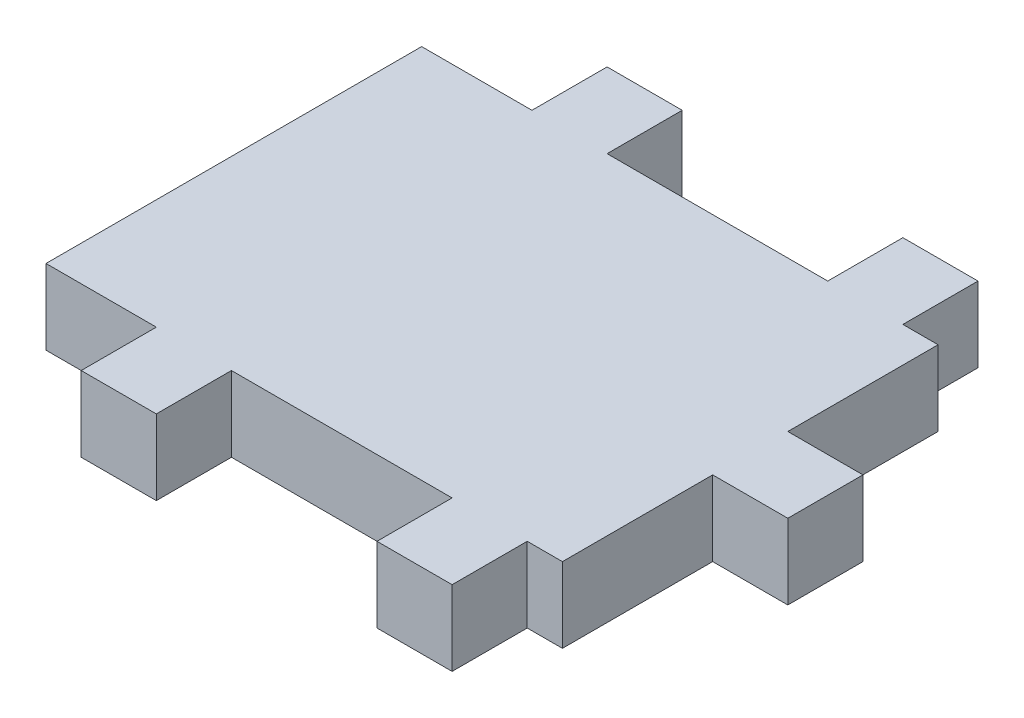
ISO-10303-21;
HEADER;
FILE_DESCRIPTION(('STEP AP214'),'2;1');
FILE_NAME('part.step','',(''),(''),'','','');
FILE_SCHEMA(('AUTOMOTIVE_DESIGN { 1 0 10303 214 1 1 1 1 }'));
ENDSEC;
DATA;
#1=APPLICATION_CONTEXT('core data for automotive mechanical design processes');
#2=APPLICATION_PROTOCOL_DEFINITION('international standard','automotive_design',2000,#1);
#3=PRODUCT_CONTEXT('',#1,'mechanical');
#4=PRODUCT('Part','Part','',(#3));
#5=PRODUCT_RELATED_PRODUCT_CATEGORY('part','',(#4));
#6=PRODUCT_DEFINITION_FORMATION('','',#4);
#7=PRODUCT_DEFINITION_CONTEXT('part definition',#1,'design');
#8=PRODUCT_DEFINITION('design','',#6,#7);
#9=PRODUCT_DEFINITION_SHAPE('','',#8);
#10=(LENGTH_UNIT() NAMED_UNIT(*) SI_UNIT(.MILLI.,.METRE.));
#11=(NAMED_UNIT(*) PLANE_ANGLE_UNIT() SI_UNIT($,.RADIAN.));
#12=(NAMED_UNIT(*) SI_UNIT($,.STERADIAN.) SOLID_ANGLE_UNIT());
#13=UNCERTAINTY_MEASURE_WITH_UNIT(LENGTH_MEASURE(1.E-05),#10,'distance_accuracy_value','');
#14=(GEOMETRIC_REPRESENTATION_CONTEXT(3) GLOBAL_UNCERTAINTY_ASSIGNED_CONTEXT((#13)) GLOBAL_UNIT_ASSIGNED_CONTEXT((#10,
#11,#12)) REPRESENTATION_CONTEXT('',''));
#15=CARTESIAN_POINT('',(0.,0.,0.));
#16=DIRECTION('',(0.,0.,1.));
#17=DIRECTION('',(1.,0.,0.));
#18=AXIS2_PLACEMENT_3D('',#15,#16,#17);
#19=CARTESIAN_POINT('',(-43.65,12.7,-31.75));
#20=DIRECTION('',(0.,0.,1.));
#21=DIRECTION('',(1.,0.,0.));
#22=AXIS2_PLACEMENT_3D('',#19,#20,#21);
#23=PLANE('',#22);
#24=DIRECTION('',(0.,-1.,0.));
#25=VECTOR('',#24,1.);
#26=CARTESIAN_POINT('',(37.699999962,0.,-31.75));
#27=LINE('',#26,#25);
#28=CARTESIAN_POINT('',(37.699999962,12.7,-31.75));
#29=VERTEX_POINT('',#28);
#30=CARTESIAN_POINT('',(37.699999962,0.,-31.75));
#31=VERTEX_POINT('',#30);
#32=EDGE_CURVE('E69',#29,#31,#27,.T.);
#33=ORIENTED_EDGE('',*,*,#32,.F.);
#34=DIRECTION('',(-1.,0.,0.));
#35=VECTOR('',#34,1.);
#36=CARTESIAN_POINT('',(-43.65,12.7,-31.75));
#37=LINE('',#36,#35);
#38=CARTESIAN_POINT('',(43.65,12.7,-31.75));
#39=VERTEX_POINT('',#38);
#40=EDGE_CURVE('E409',#39,#29,#37,.T.);
#41=ORIENTED_EDGE('',*,*,#40,.F.);
#42=DIRECTION('',(0.,-1.,0.));
#43=VECTOR('',#42,1.);
#44=CARTESIAN_POINT('',(43.65,12.7,-31.75));
#45=LINE('',#44,#43);
#46=CARTESIAN_POINT('',(43.65,0.,-31.75));
#47=VERTEX_POINT('',#46);
#48=EDGE_CURVE('E11',#39,#47,#45,.T.);
#49=ORIENTED_EDGE('',*,*,#48,.T.);
#50=DIRECTION('',(-1.,0.,0.));
#51=VECTOR('',#50,1.);
#52=CARTESIAN_POINT('',(-43.65,0.,-31.75));
#53=LINE('',#52,#51);
#54=EDGE_CURVE('E426',#47,#31,#53,.T.);
#55=ORIENTED_EDGE('',*,*,#54,.T.);
#56=EDGE_LOOP('',(#33,#41,#49,#55));
#57=FACE_BOUND('',#56,.T.);
#58=ADVANCED_FACE('F45',(#57),#23,.F.);
#59=CARTESIAN_POINT('',(24.999999962,12.7,-31.75));
#60=VERTEX_POINT('',#59);
#61=CARTESIAN_POINT('',(-12.300000038,12.7,-31.75));
#62=VERTEX_POINT('',#61);
#63=EDGE_CURVE('E61',#60,#62,#37,.T.);
#64=ORIENTED_EDGE('',*,*,#63,.F.);
#65=DIRECTION('',(0.,-1.,0.));
#66=VECTOR('',#65,1.);
#67=CARTESIAN_POINT('',(24.999999962,0.,-31.75));
#68=LINE('',#67,#66);
#69=CARTESIAN_POINT('',(24.999999962,0.,-31.75));
#70=VERTEX_POINT('',#69);
#71=EDGE_CURVE('E222',#60,#70,#68,.T.);
#72=ORIENTED_EDGE('',*,*,#71,.T.);
#73=CARTESIAN_POINT('',(-12.300000038,0.,-31.75));
#74=VERTEX_POINT('',#73);
#75=EDGE_CURVE('E430',#70,#74,#53,.T.);
#76=ORIENTED_EDGE('',*,*,#75,.T.);
#77=DIRECTION('',(0.,-1.,0.));
#78=VECTOR('',#77,1.);
#79=CARTESIAN_POINT('',(-12.300000038,0.,-31.75));
#80=LINE('',#79,#78);
#81=EDGE_CURVE('E230',#62,#74,#80,.T.);
#82=ORIENTED_EDGE('',*,*,#81,.F.);
#83=EDGE_LOOP('',(#64,#72,#76,#82));
#84=FACE_BOUND('',#83,.T.);
#85=ADVANCED_FACE('F478',(#84),#23,.F.);
#86=CARTESIAN_POINT('',(-43.65,12.7,31.75));
#87=DIRECTION('',(0.,0.,-1.));
#88=DIRECTION('',(-1.,0.,0.));
#89=AXIS2_PLACEMENT_3D('',#86,#87,#88);
#90=PLANE('',#89);
#91=DIRECTION('',(0.,-1.,0.));
#92=VECTOR('',#91,1.);
#93=CARTESIAN_POINT('',(24.999999962,0.,31.75));
#94=LINE('',#93,#92);
#95=CARTESIAN_POINT('',(24.999999962,12.7,31.75));
#96=VERTEX_POINT('',#95);
#97=CARTESIAN_POINT('',(24.999999962,0.,31.75));
#98=VERTEX_POINT('',#97);
#99=EDGE_CURVE('E298',#96,#98,#94,.T.);
#100=ORIENTED_EDGE('',*,*,#99,.F.);
#101=DIRECTION('',(1.,0.,0.));
#102=VECTOR('',#101,1.);
#103=CARTESIAN_POINT('',(-43.65,12.7,31.75));
#104=LINE('',#103,#102);
#105=CARTESIAN_POINT('',(-12.300000038,12.7,31.75));
#106=VERTEX_POINT('',#105);
#107=EDGE_CURVE('E421',#106,#96,#104,.T.);
#108=ORIENTED_EDGE('',*,*,#107,.F.);
#109=DIRECTION('',(0.,-1.,0.));
#110=VECTOR('',#109,1.);
#111=CARTESIAN_POINT('',(-12.300000038,0.,31.75));
#112=LINE('',#111,#110);
#113=CARTESIAN_POINT('',(-12.300000038,0.,31.75));
#114=VERTEX_POINT('',#113);
#115=EDGE_CURVE('E329',#106,#114,#112,.T.);
#116=ORIENTED_EDGE('',*,*,#115,.T.);
#117=DIRECTION('',(1.,0.,0.));
#118=VECTOR('',#117,1.);
#119=CARTESIAN_POINT('',(-43.65,0.,31.75));
#120=LINE('',#119,#118);
#121=EDGE_CURVE('E437',#114,#98,#120,.T.);
#122=ORIENTED_EDGE('',*,*,#121,.T.);
#123=EDGE_LOOP('',(#100,#108,#116,#122));
#124=FACE_BOUND('',#123,.T.);
#125=ADVANCED_FACE('F546',(#124),#90,.F.);
#126=DIRECTION('',(0.,-1.,0.));
#127=VECTOR('',#126,1.);
#128=CARTESIAN_POINT('',(-25.000000038,0.,31.75));
#129=LINE('',#128,#127);
#130=CARTESIAN_POINT('',(-25.000000038,12.7,31.75));
#131=VERTEX_POINT('',#130);
#132=CARTESIAN_POINT('',(-25.000000038,0.,31.75));
#133=VERTEX_POINT('',#132);
#134=EDGE_CURVE('E335',#131,#133,#129,.T.);
#135=ORIENTED_EDGE('',*,*,#134,.F.);
#136=CARTESIAN_POINT('',(-43.65,12.7,31.75));
#137=VERTEX_POINT('',#136);
#138=EDGE_CURVE('E416',#137,#131,#104,.T.);
#139=ORIENTED_EDGE('',*,*,#138,.F.);
#140=DIRECTION('',(0.,-1.,0.));
#141=VECTOR('',#140,1.);
#142=CARTESIAN_POINT('',(-43.65,12.7,31.75));
#143=LINE('',#142,#141);
#144=CARTESIAN_POINT('',(-43.65,0.,31.75));
#145=VERTEX_POINT('',#144);
#146=EDGE_CURVE('E441',#137,#145,#143,.T.);
#147=ORIENTED_EDGE('',*,*,#146,.T.);
#148=EDGE_CURVE('E434',#145,#133,#120,.T.);
#149=ORIENTED_EDGE('',*,*,#148,.T.);
#150=EDGE_LOOP('',(#135,#139,#147,#149));
#151=FACE_BOUND('',#150,.T.);
#152=ADVANCED_FACE('F459',(#151),#90,.F.);
#153=CARTESIAN_POINT('',(43.65,12.7,31.75));
#154=DIRECTION('',(-1.,0.,0.));
#155=DIRECTION('',(0.,0.,1.));
#156=AXIS2_PLACEMENT_3D('',#153,#154,#155);
#157=PLANE('',#156);
#158=DIRECTION('',(0.,1.,0.));
#159=VECTOR('',#158,1.);
#160=CARTESIAN_POINT('',(43.65,0.,-6.35));
#161=LINE('',#160,#159);
#162=CARTESIAN_POINT('',(43.65,0.,-6.35));
#163=VERTEX_POINT('',#162);
#164=CARTESIAN_POINT('',(43.65,12.7,-6.35));
#165=VERTEX_POINT('',#164);
#166=EDGE_CURVE('E365',#163,#165,#161,.T.);
#167=ORIENTED_EDGE('',*,*,#166,.F.);
#168=DIRECTION('',(0.,0.,-1.));
#169=VECTOR('',#168,1.);
#170=CARTESIAN_POINT('',(43.65,0.,31.75));
#171=LINE('',#170,#169);
#172=EDGE_CURVE('E402',#163,#47,#171,.T.);
#173=ORIENTED_EDGE('',*,*,#172,.T.);
#174=ORIENTED_EDGE('',*,*,#48,.F.);
#175=DIRECTION('',(0.,0.,-1.));
#176=VECTOR('',#175,1.);
#177=CARTESIAN_POINT('',(43.65,12.7,31.75));
#178=LINE('',#177,#176);
#179=EDGE_CURVE('E408',#165,#39,#178,.T.);
#180=ORIENTED_EDGE('',*,*,#179,.F.);
#181=EDGE_LOOP('',(#167,#173,#174,#180));
#182=FACE_BOUND('',#181,.T.);
#183=ADVANCED_FACE('F47',(#182),#157,.F.);
#184=DIRECTION('',(0.,-1.,0.));
#185=VECTOR('',#184,1.);
#186=CARTESIAN_POINT('',(43.65,0.,6.35));
#187=LINE('',#186,#185);
#188=CARTESIAN_POINT('',(43.65,12.7,6.35));
#189=VERTEX_POINT('',#188);
#190=CARTESIAN_POINT('',(43.65,0.,6.35));
#191=VERTEX_POINT('',#190);
#192=EDGE_CURVE('E371',#189,#191,#187,.T.);
#193=ORIENTED_EDGE('',*,*,#192,.F.);
#194=CARTESIAN_POINT('',(43.65,12.7,31.75));
#195=VERTEX_POINT('',#194);
#196=EDGE_CURVE('E403',#195,#189,#178,.T.);
#197=ORIENTED_EDGE('',*,*,#196,.F.);
#198=DIRECTION('',(0.,-1.,0.));
#199=VECTOR('',#198,1.);
#200=CARTESIAN_POINT('',(43.65,12.7,31.75));
#201=LINE('',#200,#199);
#202=CARTESIAN_POINT('',(43.65,0.,31.75));
#203=VERTEX_POINT('',#202);
#204=EDGE_CURVE('E420',#195,#203,#201,.T.);
#205=ORIENTED_EDGE('',*,*,#204,.T.);
#206=EDGE_CURVE('E422',#203,#191,#171,.T.);
#207=ORIENTED_EDGE('',*,*,#206,.T.);
#208=EDGE_LOOP('',(#193,#197,#205,#207));
#209=FACE_BOUND('',#208,.T.);
#210=ADVANCED_FACE('F504',(#209),#157,.F.);
#211=CARTESIAN_POINT('',(-25.000000038,12.7,-31.75));
#212=VERTEX_POINT('',#211);
#213=CARTESIAN_POINT('',(-43.65,12.7,-31.75));
#214=VERTEX_POINT('',#213);
#215=EDGE_CURVE('E407',#212,#214,#37,.T.);
#216=ORIENTED_EDGE('',*,*,#215,.F.);
#217=DIRECTION('',(0.,-1.,0.));
#218=VECTOR('',#217,1.);
#219=CARTESIAN_POINT('',(-25.000000038,0.,-31.75));
#220=LINE('',#219,#218);
#221=CARTESIAN_POINT('',(-25.000000038,0.,-31.75));
#222=VERTEX_POINT('',#221);
#223=EDGE_CURVE('E260',#212,#222,#220,.T.);
#224=ORIENTED_EDGE('',*,*,#223,.T.);
#225=CARTESIAN_POINT('',(-43.65,0.,-31.75));
#226=VERTEX_POINT('',#225);
#227=EDGE_CURVE('E425',#222,#226,#53,.T.);
#228=ORIENTED_EDGE('',*,*,#227,.T.);
#229=DIRECTION('',(0.,-1.,0.));
#230=VECTOR('',#229,1.);
#231=CARTESIAN_POINT('',(-43.65,12.7,-31.75));
#232=LINE('',#231,#230);
#233=EDGE_CURVE('E54',#214,#226,#232,.T.);
#234=ORIENTED_EDGE('',*,*,#233,.F.);
#235=EDGE_LOOP('',(#216,#224,#228,#234));
#236=FACE_BOUND('',#235,.T.);
#237=ADVANCED_FACE('F486',(#236),#23,.F.);
#238=CARTESIAN_POINT('',(-43.65,12.7,31.75));
#239=DIRECTION('',(1.,0.,0.));
#240=DIRECTION('',(0.,0.,-1.));
#241=AXIS2_PLACEMENT_3D('',#238,#239,#240);
#242=PLANE('',#241);
#243=DIRECTION('',(0.,0.,1.));
#244=VECTOR('',#243,1.);
#245=CARTESIAN_POINT('',(-43.65,0.,31.75));
#246=LINE('',#245,#244);
#247=EDGE_CURVE('E429',#226,#145,#246,.T.);
#248=ORIENTED_EDGE('',*,*,#247,.T.);
#249=ORIENTED_EDGE('',*,*,#146,.F.);
#250=DIRECTION('',(0.,0.,1.));
#251=VECTOR('',#250,1.);
#252=CARTESIAN_POINT('',(-43.65,12.7,31.75));
#253=LINE('',#252,#251);
#254=EDGE_CURVE('E412',#214,#137,#253,.T.);
#255=ORIENTED_EDGE('',*,*,#254,.F.);
#256=ORIENTED_EDGE('',*,*,#233,.T.);
#257=EDGE_LOOP('',(#248,#249,#255,#256));
#258=FACE_BOUND('',#257,.T.);
#259=ADVANCED_FACE('F450',(#258),#242,.F.);
#260=CARTESIAN_POINT('',(37.699999962,12.7,31.75));
#261=VERTEX_POINT('',#260);
#262=EDGE_CURVE('E415',#261,#195,#104,.T.);
#263=ORIENTED_EDGE('',*,*,#262,.F.);
#264=DIRECTION('',(0.,-1.,0.));
#265=VECTOR('',#264,1.);
#266=CARTESIAN_POINT('',(37.699999962,0.,31.75));
#267=LINE('',#266,#265);
#268=CARTESIAN_POINT('',(37.699999962,0.,31.75));
#269=VERTEX_POINT('',#268);
#270=EDGE_CURVE('E292',#261,#269,#267,.T.);
#271=ORIENTED_EDGE('',*,*,#270,.T.);
#272=EDGE_CURVE('E433',#269,#203,#120,.T.);
#273=ORIENTED_EDGE('',*,*,#272,.T.);
#274=ORIENTED_EDGE('',*,*,#204,.F.);
#275=EDGE_LOOP('',(#263,#271,#273,#274));
#276=FACE_BOUND('',#275,.T.);
#277=ADVANCED_FACE('F499',(#276),#90,.F.);
#278=CARTESIAN_POINT('',(0.,12.7,0.));
#279=DIRECTION('',(0.,-1.,0.));
#280=DIRECTION('',(0.,0.,-1.));
#281=AXIS2_PLACEMENT_3D('',#278,#279,#280);
#282=PLANE('',#281);
#283=ORIENTED_EDGE('',*,*,#196,.T.);
#284=DIRECTION('',(-1.,0.,0.));
#285=VECTOR('',#284,1.);
#286=CARTESIAN_POINT('',(56.35,12.7,6.35));
#287=LINE('',#286,#285);
#288=CARTESIAN_POINT('',(56.35,12.7,6.35));
#289=VERTEX_POINT('',#288);
#290=EDGE_CURVE('E394',#289,#189,#287,.T.);
#291=ORIENTED_EDGE('',*,*,#290,.F.);
#292=DIRECTION('',(0.,0.,1.));
#293=VECTOR('',#292,1.);
#294=CARTESIAN_POINT('',(56.35,12.7,6.35));
#295=LINE('',#294,#293);
#296=CARTESIAN_POINT('',(56.35,12.7,-6.35));
#297=VERTEX_POINT('',#296);
#298=EDGE_CURVE('E370',#297,#289,#295,.T.);
#299=ORIENTED_EDGE('',*,*,#298,.F.);
#300=DIRECTION('',(-1.,0.,0.));
#301=VECTOR('',#300,1.);
#302=CARTESIAN_POINT('',(56.35,12.7,-6.35));
#303=LINE('',#302,#301);
#304=EDGE_CURVE('E398',#297,#165,#303,.T.);
#305=ORIENTED_EDGE('',*,*,#304,.T.);
#306=ORIENTED_EDGE('',*,*,#179,.T.);
#307=ORIENTED_EDGE('',*,*,#40,.T.);
#308=DIRECTION('',(0.,0.,1.));
#309=VECTOR('',#308,1.);
#310=CARTESIAN_POINT('',(37.699999962,12.7,-44.45));
#311=LINE('',#310,#309);
#312=CARTESIAN_POINT('',(37.699999962,12.7,-44.45));
#313=VERTEX_POINT('',#312);
#314=EDGE_CURVE('E244',#313,#29,#311,.T.);
#315=ORIENTED_EDGE('',*,*,#314,.F.);
#316=DIRECTION('',(-1.,0.,0.));
#317=VECTOR('',#316,1.);
#318=CARTESIAN_POINT('',(0.,12.7,-44.45));
#319=LINE('',#318,#317);
#320=CARTESIAN_POINT('',(24.999999962,12.7,-44.45));
#321=VERTEX_POINT('',#320);
#322=EDGE_CURVE('E218',#313,#321,#319,.T.);
#323=ORIENTED_EDGE('',*,*,#322,.T.);
#324=DIRECTION('',(0.,0.,1.));
#325=VECTOR('',#324,1.);
#326=CARTESIAN_POINT('',(24.999999962,12.7,-44.45));
#327=LINE('',#326,#325);
#328=EDGE_CURVE('E251',#321,#60,#327,.T.);
#329=ORIENTED_EDGE('',*,*,#328,.T.);
#330=ORIENTED_EDGE('',*,*,#63,.T.);
#331=DIRECTION('',(0.,0.,1.));
#332=VECTOR('',#331,1.);
#333=CARTESIAN_POINT('',(-12.300000038,12.7,-44.45));
#334=LINE('',#333,#332);
#335=CARTESIAN_POINT('',(-12.300000038,12.7,-44.45));
#336=VERTEX_POINT('',#335);
#337=EDGE_CURVE('E272',#336,#62,#334,.T.);
#338=ORIENTED_EDGE('',*,*,#337,.F.);
#339=DIRECTION('',(-1.,0.,0.));
#340=VECTOR('',#339,1.);
#341=CARTESIAN_POINT('',(0.,12.7,-44.45));
#342=LINE('',#341,#340);
#343=CARTESIAN_POINT('',(-25.000000038,12.7,-44.45));
#344=VERTEX_POINT('',#343);
#345=EDGE_CURVE('E268',#336,#344,#342,.T.);
#346=ORIENTED_EDGE('',*,*,#345,.T.);
#347=DIRECTION('',(0.,0.,1.));
#348=VECTOR('',#347,1.);
#349=CARTESIAN_POINT('',(-25.000000038,12.7,-44.45));
#350=LINE('',#349,#348);
#351=EDGE_CURVE('E282',#344,#212,#350,.T.);
#352=ORIENTED_EDGE('',*,*,#351,.T.);
#353=ORIENTED_EDGE('',*,*,#215,.T.);
#354=ORIENTED_EDGE('',*,*,#254,.T.);
#355=ORIENTED_EDGE('',*,*,#138,.T.);
#356=DIRECTION('',(0.,0.,-1.));
#357=VECTOR('',#356,1.);
#358=CARTESIAN_POINT('',(-25.000000038,12.7,44.45));
#359=LINE('',#358,#357);
#360=CARTESIAN_POINT('',(-25.000000038,12.7,44.45));
#361=VERTEX_POINT('',#360);
#362=EDGE_CURVE('E357',#361,#131,#359,.T.);
#363=ORIENTED_EDGE('',*,*,#362,.F.);
#364=DIRECTION('',(-1.,0.,0.));
#365=VECTOR('',#364,1.);
#366=CARTESIAN_POINT('',(0.,12.7,44.45));
#367=LINE('',#366,#365);
#368=CARTESIAN_POINT('',(-12.300000038,12.7,44.45));
#369=VERTEX_POINT('',#368);
#370=EDGE_CURVE('E334',#369,#361,#367,.T.);
#371=ORIENTED_EDGE('',*,*,#370,.F.);
#372=DIRECTION('',(0.,0.,-1.));
#373=VECTOR('',#372,1.);
#374=CARTESIAN_POINT('',(-12.300000038,12.7,44.45));
#375=LINE('',#374,#373);
#376=EDGE_CURVE('E361',#369,#106,#375,.T.);
#377=ORIENTED_EDGE('',*,*,#376,.T.);
#378=ORIENTED_EDGE('',*,*,#107,.T.);
#379=DIRECTION('',(0.,0.,-1.));
#380=VECTOR('',#379,1.);
#381=CARTESIAN_POINT('',(24.999999962,12.7,44.45));
#382=LINE('',#381,#380);
#383=CARTESIAN_POINT('',(24.999999962,12.7,44.45));
#384=VERTEX_POINT('',#383);
#385=EDGE_CURVE('E321',#384,#96,#382,.T.);
#386=ORIENTED_EDGE('',*,*,#385,.F.);
#387=DIRECTION('',(-1.,0.,0.));
#388=VECTOR('',#387,1.);
#389=CARTESIAN_POINT('',(0.,12.7,44.45));
#390=LINE('',#389,#388);
#391=CARTESIAN_POINT('',(37.699999962,12.7,44.45));
#392=VERTEX_POINT('',#391);
#393=EDGE_CURVE('E297',#392,#384,#390,.T.);
#394=ORIENTED_EDGE('',*,*,#393,.F.);
#395=DIRECTION('',(0.,0.,-1.));
#396=VECTOR('',#395,1.);
#397=CARTESIAN_POINT('',(37.699999962,12.7,44.45));
#398=LINE('',#397,#396);
#399=EDGE_CURVE('E325',#392,#261,#398,.T.);
#400=ORIENTED_EDGE('',*,*,#399,.T.);
#401=ORIENTED_EDGE('',*,*,#262,.T.);
#402=EDGE_LOOP('',(#283,#291,#299,#305,#306,#307,#315,#323,#329,#330,#338,#346,#352,#353,#354,
#355,#363,#371,#377,#378,#386,#394,#400,#401));
#403=FACE_BOUND('',#402,.T.);
#404=ADVANCED_FACE('F467',(#403),#282,.F.);
#405=CARTESIAN_POINT('',(0.,0.,0.));
#406=DIRECTION('',(0.,-1.,0.));
#407=DIRECTION('',(0.,0.,-1.));
#408=AXIS2_PLACEMENT_3D('',#405,#406,#407);
#409=PLANE('',#408);
#410=ORIENTED_EDGE('',*,*,#206,.F.);
#411=ORIENTED_EDGE('',*,*,#272,.F.);
#412=DIRECTION('',(0.,0.,-1.));
#413=VECTOR('',#412,1.);
#414=CARTESIAN_POINT('',(37.699999962,0.,44.45));
#415=LINE('',#414,#413);
#416=CARTESIAN_POINT('',(37.699999962,0.,44.45));
#417=VERTEX_POINT('',#416);
#418=EDGE_CURVE('E307',#417,#269,#415,.T.);
#419=ORIENTED_EDGE('',*,*,#418,.F.);
#420=DIRECTION('',(1.,0.,0.));
#421=VECTOR('',#420,1.);
#422=CARTESIAN_POINT('',(0.,0.,44.45));
#423=LINE('',#422,#421);
#424=CARTESIAN_POINT('',(24.999999962,0.,44.45));
#425=VERTEX_POINT('',#424);
#426=EDGE_CURVE('E304',#425,#417,#423,.T.);
#427=ORIENTED_EDGE('',*,*,#426,.F.);
#428=DIRECTION('',(0.,0.,-1.));
#429=VECTOR('',#428,1.);
#430=CARTESIAN_POINT('',(24.999999962,0.,44.45));
#431=LINE('',#430,#429);
#432=EDGE_CURVE('E317',#425,#98,#431,.T.);
#433=ORIENTED_EDGE('',*,*,#432,.T.);
#434=ORIENTED_EDGE('',*,*,#121,.F.);
#435=DIRECTION('',(0.,0.,-1.));
#436=VECTOR('',#435,1.);
#437=CARTESIAN_POINT('',(-12.300000038,0.,44.45));
#438=LINE('',#437,#436);
#439=CARTESIAN_POINT('',(-12.300000038,0.,44.45));
#440=VERTEX_POINT('',#439);
#441=EDGE_CURVE('E344',#440,#114,#438,.T.);
#442=ORIENTED_EDGE('',*,*,#441,.F.);
#443=DIRECTION('',(1.,0.,0.));
#444=VECTOR('',#443,1.);
#445=CARTESIAN_POINT('',(0.,0.,44.45));
#446=LINE('',#445,#444);
#447=CARTESIAN_POINT('',(-25.000000038,0.,44.45));
#448=VERTEX_POINT('',#447);
#449=EDGE_CURVE('E341',#448,#440,#446,.T.);
#450=ORIENTED_EDGE('',*,*,#449,.F.);
#451=DIRECTION('',(0.,0.,-1.));
#452=VECTOR('',#451,1.);
#453=CARTESIAN_POINT('',(-25.000000038,0.,44.45));
#454=LINE('',#453,#452);
#455=EDGE_CURVE('E353',#448,#133,#454,.T.);
#456=ORIENTED_EDGE('',*,*,#455,.T.);
#457=ORIENTED_EDGE('',*,*,#148,.F.);
#458=ORIENTED_EDGE('',*,*,#247,.F.);
#459=ORIENTED_EDGE('',*,*,#227,.F.);
#460=DIRECTION('',(0.,0.,1.));
#461=VECTOR('',#460,1.);
#462=CARTESIAN_POINT('',(-25.000000038,0.,-44.45));
#463=LINE('',#462,#461);
#464=CARTESIAN_POINT('',(-25.000000038,0.,-44.45));
#465=VERTEX_POINT('',#464);
#466=EDGE_CURVE('E285',#465,#222,#463,.T.);
#467=ORIENTED_EDGE('',*,*,#466,.F.);
#468=DIRECTION('',(1.,0.,0.));
#469=VECTOR('',#468,1.);
#470=CARTESIAN_POINT('',(0.,0.,-44.45));
#471=LINE('',#470,#469);
#472=CARTESIAN_POINT('',(-12.300000038,0.,-44.45));
#473=VERTEX_POINT('',#472);
#474=EDGE_CURVE('E259',#465,#473,#471,.T.);
#475=ORIENTED_EDGE('',*,*,#474,.T.);
#476=DIRECTION('',(0.,0.,1.));
#477=VECTOR('',#476,1.);
#478=CARTESIAN_POINT('',(-12.300000038,0.,-44.45));
#479=LINE('',#478,#477);
#480=EDGE_CURVE('E288',#473,#74,#479,.T.);
#481=ORIENTED_EDGE('',*,*,#480,.T.);
#482=ORIENTED_EDGE('',*,*,#75,.F.);
#483=DIRECTION('',(0.,0.,1.));
#484=VECTOR('',#483,1.);
#485=CARTESIAN_POINT('',(24.999999962,0.,-44.45));
#486=LINE('',#485,#484);
#487=CARTESIAN_POINT('',(24.999999962,0.,-44.45));
#488=VERTEX_POINT('',#487);
#489=EDGE_CURVE('E231',#488,#70,#486,.T.);
#490=ORIENTED_EDGE('',*,*,#489,.F.);
#491=DIRECTION('',(1.,0.,0.));
#492=VECTOR('',#491,1.);
#493=CARTESIAN_POINT('',(0.,0.,-44.45));
#494=LINE('',#493,#492);
#495=CARTESIAN_POINT('',(37.699999962,0.,-44.45));
#496=VERTEX_POINT('',#495);
#497=EDGE_CURVE('E215',#488,#496,#494,.T.);
#498=ORIENTED_EDGE('',*,*,#497,.T.);
#499=DIRECTION('',(0.,0.,1.));
#500=VECTOR('',#499,1.);
#501=CARTESIAN_POINT('',(37.699999962,0.,-44.45));
#502=LINE('',#501,#500);
#503=EDGE_CURVE('E225',#496,#31,#502,.T.);
#504=ORIENTED_EDGE('',*,*,#503,.T.);
#505=ORIENTED_EDGE('',*,*,#54,.F.);
#506=ORIENTED_EDGE('',*,*,#172,.F.);
#507=DIRECTION('',(-1.,0.,0.));
#508=VECTOR('',#507,1.);
#509=CARTESIAN_POINT('',(56.35,0.,-6.35));
#510=LINE('',#509,#508);
#511=CARTESIAN_POINT('',(56.35,0.,-6.35));
#512=VERTEX_POINT('',#511);
#513=EDGE_CURVE('E380',#512,#163,#510,.T.);
#514=ORIENTED_EDGE('',*,*,#513,.F.);
#515=DIRECTION('',(0.,0.,-1.));
#516=VECTOR('',#515,1.);
#517=CARTESIAN_POINT('',(56.35,0.,6.35));
#518=LINE('',#517,#516);
#519=CARTESIAN_POINT('',(56.35,0.,6.35));
#520=VERTEX_POINT('',#519);
#521=EDGE_CURVE('E377',#520,#512,#518,.T.);
#522=ORIENTED_EDGE('',*,*,#521,.F.);
#523=DIRECTION('',(-1.,0.,0.));
#524=VECTOR('',#523,1.);
#525=CARTESIAN_POINT('',(56.35,0.,6.35));
#526=LINE('',#525,#524);
#527=EDGE_CURVE('E390',#520,#191,#526,.T.);
#528=ORIENTED_EDGE('',*,*,#527,.T.);
#529=EDGE_LOOP('',(#410,#411,#419,#427,#433,#434,#442,#450,#456,#457,#458,#459,#467,#475,#481,
#482,#490,#498,#504,#505,#506,#514,#522,#528));
#530=FACE_BOUND('',#529,.T.);
#531=ADVANCED_FACE('F234',(#530),#409,.T.);
#532=CARTESIAN_POINT('',(56.35,0.,-6.35));
#533=DIRECTION('',(0.,0.,1.));
#534=DIRECTION('',(0.,-1.,0.));
#535=AXIS2_PLACEMENT_3D('',#532,#533,#534);
#536=PLANE('',#535);
#537=ORIENTED_EDGE('',*,*,#166,.T.);
#538=ORIENTED_EDGE('',*,*,#304,.F.);
#539=DIRECTION('',(0.,1.,0.));
#540=VECTOR('',#539,1.);
#541=CARTESIAN_POINT('',(56.35,0.,-6.35));
#542=LINE('',#541,#540);
#543=EDGE_CURVE('E366',#512,#297,#542,.T.);
#544=ORIENTED_EDGE('',*,*,#543,.F.);
#545=ORIENTED_EDGE('',*,*,#513,.T.);
#546=EDGE_LOOP('',(#537,#538,#544,#545));
#547=FACE_BOUND('',#546,.T.);
#548=ADVANCED_FACE('F572',(#547),#536,.F.);
#549=CARTESIAN_POINT('',(56.35,0.,6.35));
#550=DIRECTION('',(0.,0.,-1.));
#551=DIRECTION('',(-1.,0.,0.));
#552=AXIS2_PLACEMENT_3D('',#549,#550,#551);
#553=PLANE('',#552);
#554=ORIENTED_EDGE('',*,*,#192,.T.);
#555=ORIENTED_EDGE('',*,*,#527,.F.);
#556=DIRECTION('',(0.,-1.,0.));
#557=VECTOR('',#556,1.);
#558=CARTESIAN_POINT('',(56.35,0.,6.35));
#559=LINE('',#558,#557);
#560=EDGE_CURVE('E374',#289,#520,#559,.T.);
#561=ORIENTED_EDGE('',*,*,#560,.F.);
#562=ORIENTED_EDGE('',*,*,#290,.T.);
#563=EDGE_LOOP('',(#554,#555,#561,#562));
#564=FACE_BOUND('',#563,.T.);
#565=ADVANCED_FACE('F509',(#564),#553,.F.);
#566=CARTESIAN_POINT('',(56.35,0.,0.));
#567=DIRECTION('',(-1.,0.,0.));
#568=DIRECTION('',(0.,0.,1.));
#569=AXIS2_PLACEMENT_3D('',#566,#567,#568);
#570=PLANE('',#569);
#571=ORIENTED_EDGE('',*,*,#543,.T.);
#572=ORIENTED_EDGE('',*,*,#298,.T.);
#573=ORIENTED_EDGE('',*,*,#560,.T.);
#574=ORIENTED_EDGE('',*,*,#521,.T.);
#575=EDGE_LOOP('',(#571,#572,#573,#574));
#576=FACE_BOUND('',#575,.T.);
#577=ADVANCED_FACE('F579',(#576),#570,.F.);
#578=CARTESIAN_POINT('',(-12.300000038,0.,44.45));
#579=DIRECTION('',(1.,0.,0.));
#580=DIRECTION('',(0.,1.,0.));
#581=AXIS2_PLACEMENT_3D('',#578,#579,#580);
#582=PLANE('',#581);
#583=ORIENTED_EDGE('',*,*,#115,.F.);
#584=ORIENTED_EDGE('',*,*,#376,.F.);
#585=DIRECTION('',(0.,-1.,0.));
#586=VECTOR('',#585,1.);
#587=CARTESIAN_POINT('',(-12.300000038,0.,44.45));
#588=LINE('',#587,#586);
#589=EDGE_CURVE('E330',#369,#440,#588,.T.);
#590=ORIENTED_EDGE('',*,*,#589,.T.);
#591=ORIENTED_EDGE('',*,*,#441,.T.);
#592=EDGE_LOOP('',(#583,#584,#590,#591));
#593=FACE_BOUND('',#592,.T.);
#594=ADVANCED_FACE('F531',(#593),#582,.T.);
#595=CARTESIAN_POINT('',(-25.000000038,0.,44.45));
#596=DIRECTION('',(1.,0.,0.));
#597=DIRECTION('',(0.,0.,-1.));
#598=AXIS2_PLACEMENT_3D('',#595,#596,#597);
#599=PLANE('',#598);
#600=ORIENTED_EDGE('',*,*,#134,.T.);
#601=ORIENTED_EDGE('',*,*,#455,.F.);
#602=DIRECTION('',(0.,-1.,0.));
#603=VECTOR('',#602,1.);
#604=CARTESIAN_POINT('',(-25.000000038,0.,44.45));
#605=LINE('',#604,#603);
#606=EDGE_CURVE('E338',#361,#448,#605,.T.);
#607=ORIENTED_EDGE('',*,*,#606,.F.);
#608=ORIENTED_EDGE('',*,*,#362,.T.);
#609=EDGE_LOOP('',(#600,#601,#607,#608));
#610=FACE_BOUND('',#609,.T.);
#611=ADVANCED_FACE('F462',(#610),#599,.F.);
#612=CARTESIAN_POINT('',(0.,0.,44.45));
#613=DIRECTION('',(0.,0.,1.));
#614=DIRECTION('',(1.,0.,0.));
#615=AXIS2_PLACEMENT_3D('',#612,#613,#614);
#616=PLANE('',#615);
#617=ORIENTED_EDGE('',*,*,#589,.F.);
#618=ORIENTED_EDGE('',*,*,#370,.T.);
#619=ORIENTED_EDGE('',*,*,#606,.T.);
#620=ORIENTED_EDGE('',*,*,#449,.T.);
#621=EDGE_LOOP('',(#617,#618,#619,#620));
#622=FACE_BOUND('',#621,.T.);
#623=ADVANCED_FACE('F533',(#622),#616,.T.);
#624=CARTESIAN_POINT('',(37.699999962,0.,44.45));
#625=DIRECTION('',(1.,0.,0.));
#626=DIRECTION('',(0.,1.,0.));
#627=AXIS2_PLACEMENT_3D('',#624,#625,#626);
#628=PLANE('',#627);
#629=ORIENTED_EDGE('',*,*,#270,.F.);
#630=ORIENTED_EDGE('',*,*,#399,.F.);
#631=DIRECTION('',(0.,-1.,0.));
#632=VECTOR('',#631,1.);
#633=CARTESIAN_POINT('',(37.699999962,0.,44.45));
#634=LINE('',#633,#632);
#635=EDGE_CURVE('E293',#392,#417,#634,.T.);
#636=ORIENTED_EDGE('',*,*,#635,.T.);
#637=ORIENTED_EDGE('',*,*,#418,.T.);
#638=EDGE_LOOP('',(#629,#630,#636,#637));
#639=FACE_BOUND('',#638,.T.);
#640=ADVANCED_FACE('F527',(#639),#628,.T.);
#641=CARTESIAN_POINT('',(24.999999962,0.,44.45));
#642=DIRECTION('',(1.,0.,0.));
#643=DIRECTION('',(0.,0.,-1.));
#644=AXIS2_PLACEMENT_3D('',#641,#642,#643);
#645=PLANE('',#644);
#646=ORIENTED_EDGE('',*,*,#99,.T.);
#647=ORIENTED_EDGE('',*,*,#432,.F.);
#648=DIRECTION('',(0.,-1.,0.));
#649=VECTOR('',#648,1.);
#650=CARTESIAN_POINT('',(24.999999962,0.,44.45));
#651=LINE('',#650,#649);
#652=EDGE_CURVE('E301',#384,#425,#651,.T.);
#653=ORIENTED_EDGE('',*,*,#652,.F.);
#654=ORIENTED_EDGE('',*,*,#385,.T.);
#655=EDGE_LOOP('',(#646,#647,#653,#654));
#656=FACE_BOUND('',#655,.T.);
#657=ADVANCED_FACE('F520',(#656),#645,.F.);
#658=CARTESIAN_POINT('',(0.,0.,44.45));
#659=DIRECTION('',(0.,0.,1.));
#660=DIRECTION('',(1.,0.,0.));
#661=AXIS2_PLACEMENT_3D('',#658,#659,#660);
#662=PLANE('',#661);
#663=ORIENTED_EDGE('',*,*,#635,.F.);
#664=ORIENTED_EDGE('',*,*,#393,.T.);
#665=ORIENTED_EDGE('',*,*,#652,.T.);
#666=ORIENTED_EDGE('',*,*,#426,.T.);
#667=EDGE_LOOP('',(#663,#664,#665,#666));
#668=FACE_BOUND('',#667,.T.);
#669=ADVANCED_FACE('F525',(#668),#662,.T.);
#670=CARTESIAN_POINT('',(-12.300000038,0.,-44.45));
#671=DIRECTION('',(-1.,0.,0.));
#672=DIRECTION('',(0.,-1.,0.));
#673=AXIS2_PLACEMENT_3D('',#670,#671,#672);
#674=PLANE('',#673);
#675=ORIENTED_EDGE('',*,*,#81,.T.);
#676=ORIENTED_EDGE('',*,*,#480,.F.);
#677=DIRECTION('',(0.,-1.,0.));
#678=VECTOR('',#677,1.);
#679=CARTESIAN_POINT('',(-12.300000038,0.,-44.45));
#680=LINE('',#679,#678);
#681=EDGE_CURVE('E256',#336,#473,#680,.T.);
#682=ORIENTED_EDGE('',*,*,#681,.F.);
#683=ORIENTED_EDGE('',*,*,#337,.T.);
#684=EDGE_LOOP('',(#675,#676,#682,#683));
#685=FACE_BOUND('',#684,.T.);
#686=ADVANCED_FACE('F475',(#685),#674,.F.);
#687=CARTESIAN_POINT('',(-25.000000038,0.,-44.45));
#688=DIRECTION('',(-1.,0.,0.));
#689=DIRECTION('',(0.,0.,1.));
#690=AXIS2_PLACEMENT_3D('',#687,#688,#689);
#691=PLANE('',#690);
#692=ORIENTED_EDGE('',*,*,#223,.F.);
#693=ORIENTED_EDGE('',*,*,#351,.F.);
#694=DIRECTION('',(0.,-1.,0.));
#695=VECTOR('',#694,1.);
#696=CARTESIAN_POINT('',(-25.000000038,0.,-44.45));
#697=LINE('',#696,#695);
#698=EDGE_CURVE('E264',#344,#465,#697,.T.);
#699=ORIENTED_EDGE('',*,*,#698,.T.);
#700=ORIENTED_EDGE('',*,*,#466,.T.);
#701=EDGE_LOOP('',(#692,#693,#699,#700));
#702=FACE_BOUND('',#701,.T.);
#703=ADVANCED_FACE('F485',(#702),#691,.T.);
#704=CARTESIAN_POINT('',(0.,0.,-44.45));
#705=DIRECTION('',(0.,0.,-1.));
#706=DIRECTION('',(1.,0.,0.));
#707=AXIS2_PLACEMENT_3D('',#704,#705,#706);
#708=PLANE('',#707);
#709=ORIENTED_EDGE('',*,*,#681,.T.);
#710=ORIENTED_EDGE('',*,*,#474,.F.);
#711=ORIENTED_EDGE('',*,*,#698,.F.);
#712=ORIENTED_EDGE('',*,*,#345,.F.);
#713=EDGE_LOOP('',(#709,#710,#711,#712));
#714=FACE_BOUND('',#713,.T.);
#715=ADVANCED_FACE('F483',(#714),#708,.T.);
#716=CARTESIAN_POINT('',(37.699999962,0.,-44.45));
#717=DIRECTION('',(-1.,0.,0.));
#718=DIRECTION('',(0.,-1.,0.));
#719=AXIS2_PLACEMENT_3D('',#716,#717,#718);
#720=PLANE('',#719);
#721=ORIENTED_EDGE('',*,*,#32,.T.);
#722=ORIENTED_EDGE('',*,*,#503,.F.);
#723=DIRECTION('',(0.,-1.,0.));
#724=VECTOR('',#723,1.);
#725=CARTESIAN_POINT('',(37.699999962,0.,-44.45));
#726=LINE('',#725,#724);
#727=EDGE_CURVE('E210',#313,#496,#726,.T.);
#728=ORIENTED_EDGE('',*,*,#727,.F.);
#729=ORIENTED_EDGE('',*,*,#314,.T.);
#730=EDGE_LOOP('',(#721,#722,#728,#729));
#731=FACE_BOUND('',#730,.T.);
#732=ADVANCED_FACE('F226',(#731),#720,.F.);
#733=CARTESIAN_POINT('',(24.999999962,0.,-44.45));
#734=DIRECTION('',(-1.,0.,0.));
#735=DIRECTION('',(0.,0.,1.));
#736=AXIS2_PLACEMENT_3D('',#733,#734,#735);
#737=PLANE('',#736);
#738=ORIENTED_EDGE('',*,*,#71,.F.);
#739=ORIENTED_EDGE('',*,*,#328,.F.);
#740=DIRECTION('',(0.,-1.,0.));
#741=VECTOR('',#740,1.);
#742=CARTESIAN_POINT('',(24.999999962,0.,-44.45));
#743=LINE('',#742,#741);
#744=EDGE_CURVE('E237',#321,#488,#743,.T.);
#745=ORIENTED_EDGE('',*,*,#744,.T.);
#746=ORIENTED_EDGE('',*,*,#489,.T.);
#747=EDGE_LOOP('',(#738,#739,#745,#746));
#748=FACE_BOUND('',#747,.T.);
#749=ADVANCED_FACE('F691',(#748),#737,.T.);
#750=CARTESIAN_POINT('',(0.,0.,-44.45));
#751=DIRECTION('',(0.,0.,-1.));
#752=DIRECTION('',(1.,0.,0.));
#753=AXIS2_PLACEMENT_3D('',#750,#751,#752);
#754=PLANE('',#753);
#755=ORIENTED_EDGE('',*,*,#727,.T.);
#756=ORIENTED_EDGE('',*,*,#497,.F.);
#757=ORIENTED_EDGE('',*,*,#744,.F.);
#758=ORIENTED_EDGE('',*,*,#322,.F.);
#759=EDGE_LOOP('',(#755,#756,#757,#758));
#760=FACE_BOUND('',#759,.T.);
#761=ADVANCED_FACE('F212',(#760),#754,.T.);
#762=CLOSED_SHELL('',(#58,#85,#125,#152,#183,#210,#237,#259,#277,#404,#531,#548,#565,#577,#594,
#611,#623,#640,#657,#669,#686,#703,#715,#732,#749,#761));
#763=MANIFOLD_SOLID_BREP('B2',#762);
#764=ADVANCED_BREP_SHAPE_REPRESENTATION('',(#18,#763),#14);
#765=SHAPE_DEFINITION_REPRESENTATION(#9,#764);
ENDSEC;
END-ISO-10303-21;
